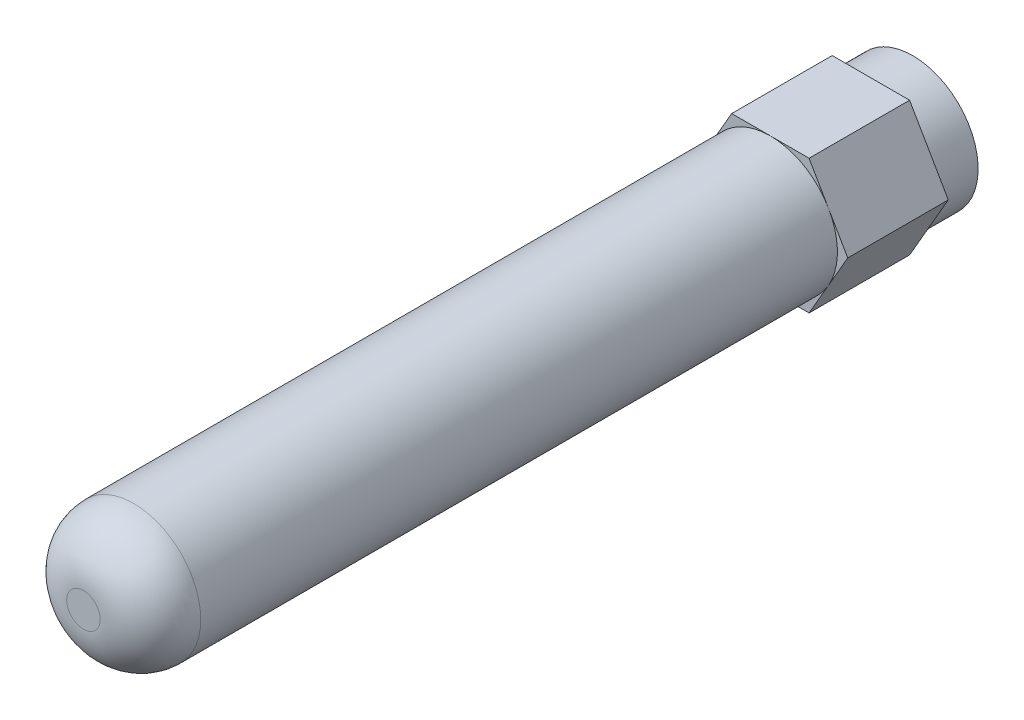
ISO-10303-21;
HEADER;
FILE_DESCRIPTION(('STEP AP214'),'2;1');
FILE_NAME('part.step','',(''),(''),'','','');
FILE_SCHEMA(('AUTOMOTIVE_DESIGN { 1 0 10303 214 1 1 1 1 }'));
ENDSEC;
DATA;
#1=APPLICATION_CONTEXT('core data for automotive mechanical design processes');
#2=APPLICATION_PROTOCOL_DEFINITION('international standard','automotive_design',2000,#1);
#3=PRODUCT_CONTEXT('',#1,'mechanical');
#4=PRODUCT('Part','Part','',(#3));
#5=PRODUCT_RELATED_PRODUCT_CATEGORY('part','',(#4));
#6=PRODUCT_DEFINITION_FORMATION('','',#4);
#7=PRODUCT_DEFINITION_CONTEXT('part definition',#1,'design');
#8=PRODUCT_DEFINITION('design','',#6,#7);
#9=PRODUCT_DEFINITION_SHAPE('','',#8);
#10=(LENGTH_UNIT() NAMED_UNIT(*) SI_UNIT(.MILLI.,.METRE.));
#11=(NAMED_UNIT(*) PLANE_ANGLE_UNIT() SI_UNIT($,.RADIAN.));
#12=(NAMED_UNIT(*) SI_UNIT($,.STERADIAN.) SOLID_ANGLE_UNIT());
#13=UNCERTAINTY_MEASURE_WITH_UNIT(LENGTH_MEASURE(1.E-05),#10,'distance_accuracy_value','');
#14=(GEOMETRIC_REPRESENTATION_CONTEXT(3) GLOBAL_UNCERTAINTY_ASSIGNED_CONTEXT((#13)) GLOBAL_UNIT_ASSIGNED_CONTEXT((#10,
#11,#12)) REPRESENTATION_CONTEXT('',''));
#15=CARTESIAN_POINT('',(0.,0.,0.));
#16=DIRECTION('',(0.,0.,1.));
#17=DIRECTION('',(1.,0.,0.));
#18=AXIS2_PLACEMENT_3D('',#15,#16,#17);
#19=CARTESIAN_POINT('',(0.,0.,41.));
#20=DIRECTION('',(0.,0.,-1.));
#21=DIRECTION('',(-1.,0.,0.));
#22=AXIS2_PLACEMENT_3D('',#19,#20,#21);
#23=CYLINDRICAL_SURFACE('',#22,4.);
#24=CARTESIAN_POINT('',(0.,0.,38.));
#25=DIRECTION('',(0.,0.,1.));
#26=DIRECTION('',(1.,0.,0.));
#27=AXIS2_PLACEMENT_3D('',#24,#25,#26);
#28=CIRCLE('',#27,4.);
#29=CARTESIAN_POINT('',(4.,0.,38.));
#30=VERTEX_POINT('',#29);
#31=EDGE_CURVE('E11',#30,#30,#28,.F.);
#32=ORIENTED_EDGE('',*,*,#31,.T.);
#33=EDGE_LOOP('',(#32));
#34=FACE_BOUND('',#33,.T.);
#35=CARTESIAN_POINT('',(0.,0.,0.));
#36=DIRECTION('',(0.,0.,1.));
#37=DIRECTION('',(1.,0.,0.));
#38=AXIS2_PLACEMENT_3D('',#35,#36,#37);
#39=CIRCLE('',#38,4.);
#40=CARTESIAN_POINT('',(3.46410161513775,2.,0.));
#41=VERTEX_POINT('',#40);
#42=CARTESIAN_POINT('',(0.,4.,0.));
#43=VERTEX_POINT('',#42);
#44=EDGE_CURVE('E144',#41,#43,#39,.T.);
#45=ORIENTED_EDGE('',*,*,#44,.T.);
#46=CARTESIAN_POINT('',(-3.46410161513775,2.,0.));
#47=VERTEX_POINT('',#46);
#48=EDGE_CURVE('E151',#43,#47,#39,.T.);
#49=ORIENTED_EDGE('',*,*,#48,.T.);
#50=CARTESIAN_POINT('',(-3.46410161513775,-2.,0.));
#51=VERTEX_POINT('',#50);
#52=EDGE_CURVE('E398',#47,#51,#39,.T.);
#53=ORIENTED_EDGE('',*,*,#52,.T.);
#54=CARTESIAN_POINT('',(0.,-4.,0.));
#55=VERTEX_POINT('',#54);
#56=EDGE_CURVE('E225',#51,#55,#39,.T.);
#57=ORIENTED_EDGE('',*,*,#56,.T.);
#58=CARTESIAN_POINT('',(3.46410161513775,-2.,0.));
#59=VERTEX_POINT('',#58);
#60=EDGE_CURVE('E142',#55,#59,#39,.T.);
#61=ORIENTED_EDGE('',*,*,#60,.T.);
#62=EDGE_CURVE('E62',#59,#41,#39,.T.);
#63=ORIENTED_EDGE('',*,*,#62,.T.);
#64=EDGE_LOOP('',(#45,#49,#53,#57,#61,#63));
#65=FACE_BOUND('',#64,.T.);
#66=ADVANCED_FACE('F39',(#34,#65),#23,.T.);
#67=CARTESIAN_POINT('',(0.,0.,41.));
#68=DIRECTION('',(0.,0.,1.));
#69=DIRECTION('',(1.,0.,0.));
#70=AXIS2_PLACEMENT_3D('',#67,#68,#69);
#71=PLANE('',#70);
#72=CARTESIAN_POINT('',(0.,0.,41.));
#73=DIRECTION('',(0.,0.,1.));
#74=DIRECTION('',(1.,0.,0.));
#75=AXIS2_PLACEMENT_3D('',#72,#73,#74);
#76=CIRCLE('',#75,1.);
#77=CARTESIAN_POINT('',(1.,0.,41.));
#78=VERTEX_POINT('',#77);
#79=EDGE_CURVE('E48',#78,#78,#76,.T.);
#80=ORIENTED_EDGE('',*,*,#79,.T.);
#81=EDGE_LOOP('',(#80));
#82=FACE_BOUND('',#81,.T.);
#83=ADVANCED_FACE('F254',(#82),#71,.T.);
#84=CARTESIAN_POINT('',(0.,0.,0.));
#85=DIRECTION('',(0.,0.,-1.));
#86=DIRECTION('',(-1.,0.,0.));
#87=AXIS2_PLACEMENT_3D('',#84,#85,#86);
#88=PLANE('',#87);
#89=ORIENTED_EDGE('',*,*,#44,.F.);
#90=DIRECTION('',(0.5,-0.866025403784439,0.));
#91=VECTOR('',#90,1.);
#92=CARTESIAN_POINT('',(2.3094010767585,4.,0.));
#93=LINE('',#92,#91);
#94=CARTESIAN_POINT('',(2.3094010767585,4.,0.));
#95=VERTEX_POINT('',#94);
#96=EDGE_CURVE('E55',#95,#41,#93,.T.);
#97=ORIENTED_EDGE('',*,*,#96,.F.);
#98=DIRECTION('',(1.,0.,0.));
#99=VECTOR('',#98,1.);
#100=CARTESIAN_POINT('',(-2.3094010767585,4.,0.));
#101=LINE('',#100,#99);
#102=EDGE_CURVE('E137',#43,#95,#101,.T.);
#103=ORIENTED_EDGE('',*,*,#102,.F.);
#104=EDGE_LOOP('',(#89,#97,#103));
#105=FACE_BOUND('',#104,.T.);
#106=ADVANCED_FACE('F251',(#105),#88,.F.);
#107=ORIENTED_EDGE('',*,*,#48,.F.);
#108=CARTESIAN_POINT('',(-2.3094010767585,4.,0.));
#109=VERTEX_POINT('',#108);
#110=EDGE_CURVE('E175',#109,#43,#101,.T.);
#111=ORIENTED_EDGE('',*,*,#110,.F.);
#112=DIRECTION('',(0.5,0.866025403784438,0.));
#113=VECTOR('',#112,1.);
#114=CARTESIAN_POINT('',(-4.61880215351701,0.,0.));
#115=LINE('',#114,#113);
#116=EDGE_CURVE('E196',#47,#109,#115,.T.);
#117=ORIENTED_EDGE('',*,*,#116,.F.);
#118=EDGE_LOOP('',(#107,#111,#117));
#119=FACE_BOUND('',#118,.T.);
#120=ADVANCED_FACE('F346',(#119),#88,.F.);
#121=ORIENTED_EDGE('',*,*,#52,.F.);
#122=CARTESIAN_POINT('',(-4.61880215351701,0.,0.));
#123=VERTEX_POINT('',#122);
#124=EDGE_CURVE('E132',#123,#47,#115,.T.);
#125=ORIENTED_EDGE('',*,*,#124,.F.);
#126=DIRECTION('',(-0.5,0.866025403784439,0.));
#127=VECTOR('',#126,1.);
#128=CARTESIAN_POINT('',(-2.3094010767585,-4.,0.));
#129=LINE('',#128,#127);
#130=EDGE_CURVE('E191',#51,#123,#129,.T.);
#131=ORIENTED_EDGE('',*,*,#130,.F.);
#132=EDGE_LOOP('',(#121,#125,#131));
#133=FACE_BOUND('',#132,.T.);
#134=ADVANCED_FACE('F338',(#133),#88,.F.);
#135=ORIENTED_EDGE('',*,*,#56,.F.);
#136=CARTESIAN_POINT('',(-2.3094010767585,-4.,0.));
#137=VERTEX_POINT('',#136);
#138=EDGE_CURVE('E192',#137,#51,#129,.T.);
#139=ORIENTED_EDGE('',*,*,#138,.F.);
#140=DIRECTION('',(-1.,0.,0.));
#141=VECTOR('',#140,1.);
#142=CARTESIAN_POINT('',(2.3094010767585,-4.,0.));
#143=LINE('',#142,#141);
#144=EDGE_CURVE('E186',#55,#137,#143,.T.);
#145=ORIENTED_EDGE('',*,*,#144,.F.);
#146=EDGE_LOOP('',(#135,#139,#145));
#147=FACE_BOUND('',#146,.T.);
#148=ADVANCED_FACE('F228',(#147),#88,.F.);
#149=ORIENTED_EDGE('',*,*,#60,.F.);
#150=CARTESIAN_POINT('',(2.3094010767585,-4.,0.));
#151=VERTEX_POINT('',#150);
#152=EDGE_CURVE('E187',#151,#55,#143,.T.);
#153=ORIENTED_EDGE('',*,*,#152,.F.);
#154=DIRECTION('',(-0.5,-0.866025403784438,0.));
#155=VECTOR('',#154,1.);
#156=CARTESIAN_POINT('',(4.61880215351701,0.,0.));
#157=LINE('',#156,#155);
#158=EDGE_CURVE('E181',#59,#151,#157,.T.);
#159=ORIENTED_EDGE('',*,*,#158,.F.);
#160=EDGE_LOOP('',(#149,#153,#159));
#161=FACE_BOUND('',#160,.T.);
#162=ADVANCED_FACE('F220',(#161),#88,.F.);
#163=CARTESIAN_POINT('',(-2.3094010767585,4.,-6.));
#164=DIRECTION('',(0.,-1.,0.));
#165=DIRECTION('',(0.,0.,-1.));
#166=AXIS2_PLACEMENT_3D('',#163,#164,#165);
#167=PLANE('',#166);
#168=ORIENTED_EDGE('',*,*,#110,.T.);
#169=ORIENTED_EDGE('',*,*,#102,.T.);
#170=DIRECTION('',(0.,0.,1.));
#171=VECTOR('',#170,1.);
#172=CARTESIAN_POINT('',(2.3094010767585,4.,-6.));
#173=LINE('',#172,#171);
#174=CARTESIAN_POINT('',(2.3094010767585,4.,-6.));
#175=VERTEX_POINT('',#174);
#176=EDGE_CURVE('E115',#175,#95,#173,.T.);
#177=ORIENTED_EDGE('',*,*,#176,.F.);
#178=DIRECTION('',(1.,0.,0.));
#179=VECTOR('',#178,1.);
#180=CARTESIAN_POINT('',(-2.3094010767585,4.,-6.));
#181=LINE('',#180,#179);
#182=CARTESIAN_POINT('',(-2.3094010767585,4.,-6.));
#183=VERTEX_POINT('',#182);
#184=EDGE_CURVE('E122',#183,#175,#181,.T.);
#185=ORIENTED_EDGE('',*,*,#184,.F.);
#186=DIRECTION('',(0.,0.,1.));
#187=VECTOR('',#186,1.);
#188=CARTESIAN_POINT('',(-2.3094010767585,4.,-6.));
#189=LINE('',#188,#187);
#190=EDGE_CURVE('E174',#183,#109,#189,.T.);
#191=ORIENTED_EDGE('',*,*,#190,.T.);
#192=EDGE_LOOP('',(#168,#169,#177,#185,#191));
#193=FACE_BOUND('',#192,.T.);
#194=ADVANCED_FACE('F135',(#193),#167,.F.);
#195=CARTESIAN_POINT('',(2.3094010767585,4.,-6.));
#196=DIRECTION('',(-0.866025403784439,-0.5,0.));
#197=DIRECTION('',(0.5,-0.866025403784439,0.));
#198=AXIS2_PLACEMENT_3D('',#195,#196,#197);
#199=PLANE('',#198);
#200=ORIENTED_EDGE('',*,*,#96,.T.);
#201=CARTESIAN_POINT('',(4.61880215351701,0.,0.));
#202=VERTEX_POINT('',#201);
#203=EDGE_CURVE('E178',#41,#202,#93,.T.);
#204=ORIENTED_EDGE('',*,*,#203,.T.);
#205=DIRECTION('',(0.,0.,1.));
#206=VECTOR('',#205,1.);
#207=CARTESIAN_POINT('',(4.61880215351701,0.,-6.));
#208=LINE('',#207,#206);
#209=CARTESIAN_POINT('',(4.61880215351701,0.,-6.));
#210=VERTEX_POINT('',#209);
#211=EDGE_CURVE('E117',#210,#202,#208,.T.);
#212=ORIENTED_EDGE('',*,*,#211,.F.);
#213=DIRECTION('',(0.5,-0.866025403784439,0.));
#214=VECTOR('',#213,1.);
#215=CARTESIAN_POINT('',(2.3094010767585,4.,-6.));
#216=LINE('',#215,#214);
#217=EDGE_CURVE('E111',#175,#210,#216,.T.);
#218=ORIENTED_EDGE('',*,*,#217,.F.);
#219=ORIENTED_EDGE('',*,*,#176,.T.);
#220=EDGE_LOOP('',(#200,#204,#212,#218,#219));
#221=FACE_BOUND('',#220,.T.);
#222=ADVANCED_FACE('F113',(#221),#199,.F.);
#223=CARTESIAN_POINT('',(4.61880215351701,0.,-6.));
#224=DIRECTION('',(-0.866025403784439,0.5,0.));
#225=DIRECTION('',(-0.5,-0.866025403784439,0.));
#226=AXIS2_PLACEMENT_3D('',#223,#224,#225);
#227=PLANE('',#226);
#228=EDGE_CURVE('E182',#202,#59,#157,.T.);
#229=ORIENTED_EDGE('',*,*,#228,.T.);
#230=ORIENTED_EDGE('',*,*,#158,.T.);
#231=DIRECTION('',(0.,0.,1.));
#232=VECTOR('',#231,1.);
#233=CARTESIAN_POINT('',(2.3094010767585,-4.,-6.));
#234=LINE('',#233,#232);
#235=CARTESIAN_POINT('',(2.3094010767585,-4.,-6.));
#236=VERTEX_POINT('',#235);
#237=EDGE_CURVE('E145',#236,#151,#234,.T.);
#238=ORIENTED_EDGE('',*,*,#237,.F.);
#239=DIRECTION('',(-0.5,-0.866025403784438,0.));
#240=VECTOR('',#239,1.);
#241=CARTESIAN_POINT('',(4.61880215351701,0.,-6.));
#242=LINE('',#241,#240);
#243=EDGE_CURVE('E121',#210,#236,#242,.T.);
#244=ORIENTED_EDGE('',*,*,#243,.F.);
#245=ORIENTED_EDGE('',*,*,#211,.T.);
#246=EDGE_LOOP('',(#229,#230,#238,#244,#245));
#247=FACE_BOUND('',#246,.T.);
#248=ADVANCED_FACE('F265',(#247),#227,.F.);
#249=CARTESIAN_POINT('',(2.3094010767585,-4.,-6.));
#250=DIRECTION('',(0.,1.,0.));
#251=DIRECTION('',(0.,0.,1.));
#252=AXIS2_PLACEMENT_3D('',#249,#250,#251);
#253=PLANE('',#252);
#254=ORIENTED_EDGE('',*,*,#152,.T.);
#255=ORIENTED_EDGE('',*,*,#144,.T.);
#256=DIRECTION('',(0.,0.,1.));
#257=VECTOR('',#256,1.);
#258=CARTESIAN_POINT('',(-2.3094010767585,-4.,-6.));
#259=LINE('',#258,#257);
#260=CARTESIAN_POINT('',(-2.3094010767585,-4.,-6.));
#261=VERTEX_POINT('',#260);
#262=EDGE_CURVE('E206',#261,#137,#259,.T.);
#263=ORIENTED_EDGE('',*,*,#262,.F.);
#264=DIRECTION('',(-1.,0.,0.));
#265=VECTOR('',#264,1.);
#266=CARTESIAN_POINT('',(2.3094010767585,-4.,-6.));
#267=LINE('',#266,#265);
#268=EDGE_CURVE('E166',#236,#261,#267,.T.);
#269=ORIENTED_EDGE('',*,*,#268,.F.);
#270=ORIENTED_EDGE('',*,*,#237,.T.);
#271=EDGE_LOOP('',(#254,#255,#263,#269,#270));
#272=FACE_BOUND('',#271,.T.);
#273=ADVANCED_FACE('F215',(#272),#253,.F.);
#274=CARTESIAN_POINT('',(-2.3094010767585,-4.,-6.));
#275=DIRECTION('',(0.866025403784439,0.5,0.));
#276=DIRECTION('',(-0.5,0.866025403784439,0.));
#277=AXIS2_PLACEMENT_3D('',#274,#275,#276);
#278=PLANE('',#277);
#279=ORIENTED_EDGE('',*,*,#138,.T.);
#280=ORIENTED_EDGE('',*,*,#130,.T.);
#281=DIRECTION('',(0.,0.,1.));
#282=VECTOR('',#281,1.);
#283=CARTESIAN_POINT('',(-4.61880215351701,0.,-6.));
#284=LINE('',#283,#282);
#285=CARTESIAN_POINT('',(-4.61880215351701,0.,-6.));
#286=VERTEX_POINT('',#285);
#287=EDGE_CURVE('E202',#286,#123,#284,.T.);
#288=ORIENTED_EDGE('',*,*,#287,.F.);
#289=DIRECTION('',(-0.5,0.866025403784439,0.));
#290=VECTOR('',#289,1.);
#291=CARTESIAN_POINT('',(-2.3094010767585,-4.,-6.));
#292=LINE('',#291,#290);
#293=EDGE_CURVE('E169',#261,#286,#292,.T.);
#294=ORIENTED_EDGE('',*,*,#293,.F.);
#295=ORIENTED_EDGE('',*,*,#262,.T.);
#296=EDGE_LOOP('',(#279,#280,#288,#294,#295));
#297=FACE_BOUND('',#296,.T.);
#298=ADVANCED_FACE('F270',(#297),#278,.F.);
#299=CARTESIAN_POINT('',(-4.61880215351701,0.,-6.));
#300=DIRECTION('',(0.866025403784439,-0.5,0.));
#301=DIRECTION('',(0.5,0.866025403784439,0.));
#302=AXIS2_PLACEMENT_3D('',#299,#300,#301);
#303=PLANE('',#302);
#304=ORIENTED_EDGE('',*,*,#124,.T.);
#305=ORIENTED_EDGE('',*,*,#116,.T.);
#306=ORIENTED_EDGE('',*,*,#190,.F.);
#307=DIRECTION('',(0.5,0.866025403784438,0.));
#308=VECTOR('',#307,1.);
#309=CARTESIAN_POINT('',(-4.61880215351701,0.,-6.));
#310=LINE('',#309,#308);
#311=EDGE_CURVE('E127',#286,#183,#310,.T.);
#312=ORIENTED_EDGE('',*,*,#311,.F.);
#313=ORIENTED_EDGE('',*,*,#287,.T.);
#314=EDGE_LOOP('',(#304,#305,#306,#312,#313));
#315=FACE_BOUND('',#314,.T.);
#316=ADVANCED_FACE('F273',(#315),#303,.F.);
#317=CARTESIAN_POINT('',(0.,0.,-6.));
#318=DIRECTION('',(0.,0.,-1.));
#319=DIRECTION('',(-1.,0.,0.));
#320=AXIS2_PLACEMENT_3D('',#317,#318,#319);
#321=PLANE('',#320);
#322=CARTESIAN_POINT('',(0.,0.,-6.));
#323=DIRECTION('',(0.,0.,-1.));
#324=DIRECTION('',(-1.,0.,0.));
#325=AXIS2_PLACEMENT_3D('',#322,#323,#324);
#326=CIRCLE('',#325,3.9);
#327=CARTESIAN_POINT('',(-3.9,0.,-6.));
#328=VERTEX_POINT('',#327);
#329=EDGE_CURVE('E150',#328,#328,#326,.T.);
#330=ORIENTED_EDGE('',*,*,#329,.F.);
#331=EDGE_LOOP('',(#330));
#332=FACE_BOUND('',#331,.T.);
#333=ORIENTED_EDGE('',*,*,#184,.T.);
#334=ORIENTED_EDGE('',*,*,#217,.T.);
#335=ORIENTED_EDGE('',*,*,#243,.T.);
#336=ORIENTED_EDGE('',*,*,#268,.T.);
#337=ORIENTED_EDGE('',*,*,#293,.T.);
#338=ORIENTED_EDGE('',*,*,#311,.T.);
#339=EDGE_LOOP('',(#333,#334,#335,#336,#337,#338));
#340=FACE_BOUND('',#339,.T.);
#341=ADVANCED_FACE('F125',(#332,#340),#321,.T.);
#342=ORIENTED_EDGE('',*,*,#62,.F.);
#343=ORIENTED_EDGE('',*,*,#228,.F.);
#344=ORIENTED_EDGE('',*,*,#203,.F.);
#345=EDGE_LOOP('',(#342,#343,#344));
#346=FACE_BOUND('',#345,.T.);
#347=ADVANCED_FACE('F243',(#346),#88,.F.);
#348=CARTESIAN_POINT('',(0.,0.,-8.5));
#349=DIRECTION('',(0.,0.,1.));
#350=DIRECTION('',(1.,0.,0.));
#351=AXIS2_PLACEMENT_3D('',#348,#349,#350);
#352=CYLINDRICAL_SURFACE('',#351,3.9);
#353=CARTESIAN_POINT('',(0.,0.,-8.5));
#354=DIRECTION('',(0.,0.,-1.));
#355=DIRECTION('',(-1.,0.,0.));
#356=AXIS2_PLACEMENT_3D('',#353,#354,#355);
#357=CIRCLE('',#356,3.9);
#358=CARTESIAN_POINT('',(-3.9,0.,-8.5));
#359=VERTEX_POINT('',#358);
#360=EDGE_CURVE('E162',#359,#359,#357,.T.);
#361=ORIENTED_EDGE('',*,*,#360,.F.);
#362=EDGE_LOOP('',(#361));
#363=FACE_BOUND('',#362,.T.);
#364=ORIENTED_EDGE('',*,*,#329,.T.);
#365=EDGE_LOOP('',(#364));
#366=FACE_BOUND('',#365,.T.);
#367=ADVANCED_FACE('F241',(#363,#366),#352,.T.);
#368=CARTESIAN_POINT('',(0.,0.,-8.5));
#369=DIRECTION('',(0.,0.,-1.));
#370=DIRECTION('',(-1.,0.,0.));
#371=AXIS2_PLACEMENT_3D('',#368,#369,#370);
#372=PLANE('',#371);
#373=ORIENTED_EDGE('',*,*,#360,.T.);
#374=EDGE_LOOP('',(#373));
#375=FACE_BOUND('',#374,.T.);
#376=ADVANCED_FACE('F239',(#375),#372,.T.);
#377=CARTESIAN_POINT('',(0.,0.,38.));
#378=DIRECTION('',(0.,0.,1.));
#379=DIRECTION('',(1.,0.,0.));
#380=AXIS2_PLACEMENT_3D('',#377,#378,#379);
#381=DEGENERATE_TOROIDAL_SURFACE('',#380,1.,3.,.T.);
#382=ORIENTED_EDGE('',*,*,#31,.F.);
#383=EDGE_LOOP('',(#382));
#384=FACE_BOUND('',#383,.T.);
#385=ORIENTED_EDGE('',*,*,#79,.F.);
#386=EDGE_LOOP('',(#385));
#387=FACE_BOUND('',#386,.T.);
#388=ADVANCED_FACE('F41',(#384,#387),#381,.T.);
#389=CLOSED_SHELL('',(#66,#83,#106,#120,#134,#148,#162,#194,#222,#248,#273,#298,#316,#341,#347,
#367,#376,#388));
#390=MANIFOLD_SOLID_BREP('B2',#389);
#391=ADVANCED_BREP_SHAPE_REPRESENTATION('',(#18,#390),#14);
#392=SHAPE_DEFINITION_REPRESENTATION(#9,#391);
ENDSEC;
END-ISO-10303-21;
